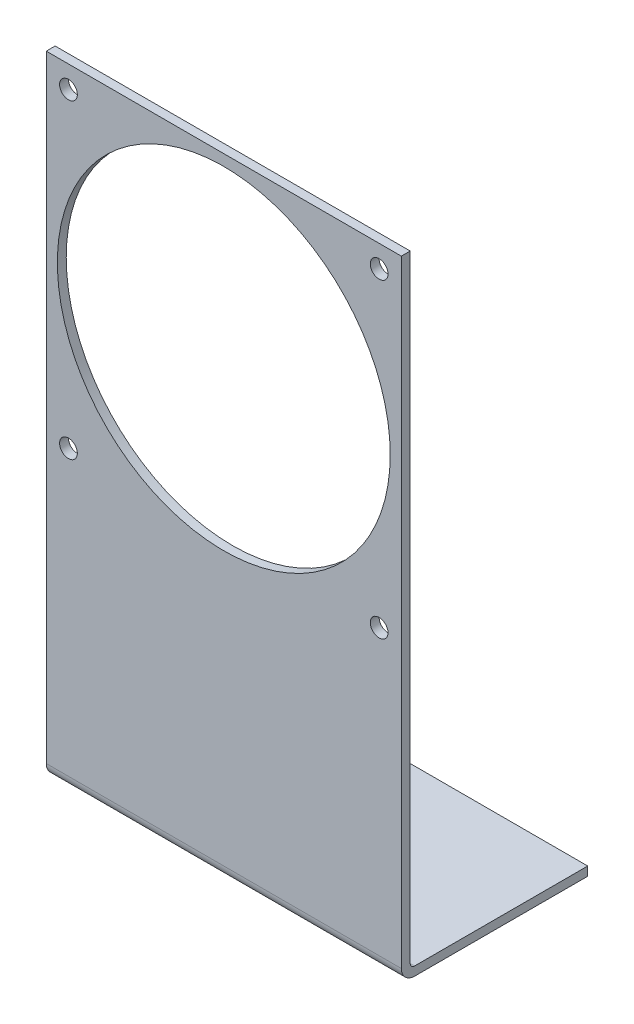
ISO-10303-21;
HEADER;
FILE_DESCRIPTION(('STEP AP214'),'2;1');
FILE_NAME('part.step','',(''),(''),'','','');
FILE_SCHEMA(('AUTOMOTIVE_DESIGN { 1 0 10303 214 1 1 1 1 }'));
ENDSEC;
DATA;
#1=APPLICATION_CONTEXT('core data for automotive mechanical design processes');
#2=APPLICATION_PROTOCOL_DEFINITION('international standard','automotive_design',2000,#1);
#3=PRODUCT_CONTEXT('',#1,'mechanical');
#4=PRODUCT('Part','Part','',(#3));
#5=PRODUCT_RELATED_PRODUCT_CATEGORY('part','',(#4));
#6=PRODUCT_DEFINITION_FORMATION('','',#4);
#7=PRODUCT_DEFINITION_CONTEXT('part definition',#1,'design');
#8=PRODUCT_DEFINITION('design','',#6,#7);
#9=PRODUCT_DEFINITION_SHAPE('','',#8);
#10=(LENGTH_UNIT() NAMED_UNIT(*) SI_UNIT(.MILLI.,.METRE.));
#11=(NAMED_UNIT(*) PLANE_ANGLE_UNIT() SI_UNIT($,.RADIAN.));
#12=(NAMED_UNIT(*) SI_UNIT($,.STERADIAN.) SOLID_ANGLE_UNIT());
#13=UNCERTAINTY_MEASURE_WITH_UNIT(LENGTH_MEASURE(1.E-05),#10,'distance_accuracy_value','');
#14=(GEOMETRIC_REPRESENTATION_CONTEXT(3) GLOBAL_UNCERTAINTY_ASSIGNED_CONTEXT((#13)) GLOBAL_UNIT_ASSIGNED_CONTEXT((#10,
#11,#12)) REPRESENTATION_CONTEXT('',''));
#15=CARTESIAN_POINT('',(0.,0.,0.));
#16=DIRECTION('',(0.,0.,1.));
#17=DIRECTION('',(1.,0.,0.));
#18=AXIS2_PLACEMENT_3D('',#15,#16,#17);
#19=CARTESIAN_POINT('',(0.,1.,40.));
#20=DIRECTION('',(-1.,0.,0.));
#21=DIRECTION('',(0.,1.,0.));
#22=AXIS2_PLACEMENT_3D('',#19,#20,#21);
#23=PLANE('',#22);
#24=DIRECTION('',(0.,1.,0.));
#25=VECTOR('',#24,1.);
#26=CARTESIAN_POINT('',(0.,1.,40.));
#27=LINE('',#26,#25);
#28=CARTESIAN_POINT('',(0.,1.,40.));
#29=VERTEX_POINT('',#28);
#30=CARTESIAN_POINT('',(0.,140.,40.));
#31=VERTEX_POINT('',#30);
#32=EDGE_CURVE('E140',#29,#31,#27,.T.);
#33=ORIENTED_EDGE('',*,*,#32,.F.);
#34=CARTESIAN_POINT('',(0.,0.999999999999995,39.));
#35=DIRECTION('',(-1.,0.,0.));
#36=DIRECTION('',(0.,0.,-1.));
#37=AXIS2_PLACEMENT_3D('',#34,#35,#36);
#38=CIRCLE('',#37,1.);
#39=CARTESIAN_POINT('',(0.,0.,39.));
#40=VERTEX_POINT('',#39);
#41=EDGE_CURVE('E143',#40,#29,#38,.T.);
#42=ORIENTED_EDGE('',*,*,#41,.F.);
#43=DIRECTION('',(0.,0.,1.));
#44=VECTOR('',#43,1.);
#45=CARTESIAN_POINT('',(0.,0.,0.));
#46=LINE('',#45,#44);
#47=CARTESIAN_POINT('',(0.,0.,0.));
#48=VERTEX_POINT('',#47);
#49=EDGE_CURVE('E96',#48,#40,#46,.T.);
#50=ORIENTED_EDGE('',*,*,#49,.F.);
#51=DIRECTION('',(0.,1.,0.));
#52=VECTOR('',#51,1.);
#53=CARTESIAN_POINT('',(0.,0.,0.));
#54=LINE('',#53,#52);
#55=CARTESIAN_POINT('',(0.,-2.,0.));
#56=VERTEX_POINT('',#55);
#57=EDGE_CURVE('E11',#56,#48,#54,.T.);
#58=ORIENTED_EDGE('',*,*,#57,.F.);
#59=DIRECTION('',(0.,0.,1.));
#60=VECTOR('',#59,1.);
#61=CARTESIAN_POINT('',(0.,-2.,0.));
#62=LINE('',#61,#60);
#63=CARTESIAN_POINT('',(0.,-2.00000000000001,39.));
#64=VERTEX_POINT('',#63);
#65=EDGE_CURVE('E93',#56,#64,#62,.T.);
#66=ORIENTED_EDGE('',*,*,#65,.T.);
#67=CARTESIAN_POINT('',(0.,0.999999999999995,39.));
#68=DIRECTION('',(1.,0.,0.));
#69=DIRECTION('',(0.,0.,-1.));
#70=AXIS2_PLACEMENT_3D('',#67,#68,#69);
#71=CIRCLE('',#70,3.);
#72=CARTESIAN_POINT('',(0.,1.,42.));
#73=VERTEX_POINT('',#72);
#74=EDGE_CURVE('E117',#64,#73,#71,.F.);
#75=ORIENTED_EDGE('',*,*,#74,.T.);
#76=DIRECTION('',(0.,1.,0.));
#77=VECTOR('',#76,1.);
#78=CARTESIAN_POINT('',(0.,1.,42.));
#79=LINE('',#78,#77);
#80=CARTESIAN_POINT('',(0.,140.,42.));
#81=VERTEX_POINT('',#80);
#82=EDGE_CURVE('E158',#73,#81,#79,.T.);
#83=ORIENTED_EDGE('',*,*,#82,.T.);
#84=DIRECTION('',(0.,0.,-1.));
#85=VECTOR('',#84,1.);
#86=CARTESIAN_POINT('',(0.,140.,40.));
#87=LINE('',#86,#85);
#88=EDGE_CURVE('E43',#81,#31,#87,.T.);
#89=ORIENTED_EDGE('',*,*,#88,.T.);
#90=EDGE_LOOP('',(#33,#42,#50,#58,#66,#75,#83,#89));
#91=FACE_BOUND('',#90,.T.);
#92=ADVANCED_FACE('F33',(#91),#23,.T.);
#93=CARTESIAN_POINT('',(0.,140.,40.));
#94=DIRECTION('',(0.,1.,0.));
#95=DIRECTION('',(1.,0.,0.));
#96=AXIS2_PLACEMENT_3D('',#93,#94,#95);
#97=PLANE('',#96);
#98=ORIENTED_EDGE('',*,*,#88,.F.);
#99=DIRECTION('',(-1.,0.,0.));
#100=VECTOR('',#99,1.);
#101=CARTESIAN_POINT('',(0.,140.,42.));
#102=LINE('',#101,#100);
#103=CARTESIAN_POINT('',(80.,140.,42.));
#104=VERTEX_POINT('',#103);
#105=EDGE_CURVE('E163',#81,#104,#102,.F.);
#106=ORIENTED_EDGE('',*,*,#105,.T.);
#107=DIRECTION('',(0.,0.,-1.));
#108=VECTOR('',#107,1.);
#109=CARTESIAN_POINT('',(80.,140.,40.));
#110=LINE('',#109,#108);
#111=CARTESIAN_POINT('',(80.,140.,40.));
#112=VERTEX_POINT('',#111);
#113=EDGE_CURVE('E120',#104,#112,#110,.T.);
#114=ORIENTED_EDGE('',*,*,#113,.T.);
#115=DIRECTION('',(1.,0.,0.));
#116=VECTOR('',#115,1.);
#117=CARTESIAN_POINT('',(0.,140.,40.));
#118=LINE('',#117,#116);
#119=EDGE_CURVE('E142',#31,#112,#118,.T.);
#120=ORIENTED_EDGE('',*,*,#119,.F.);
#121=EDGE_LOOP('',(#98,#106,#114,#120));
#122=FACE_BOUND('',#121,.T.);
#123=ADVANCED_FACE('F171',(#122),#97,.T.);
#124=CARTESIAN_POINT('',(80.,0.,0.));
#125=DIRECTION('',(-1.,0.,0.));
#126=DIRECTION('',(0.,0.,1.));
#127=AXIS2_PLACEMENT_3D('',#124,#125,#126);
#128=PLANE('',#127);
#129=DIRECTION('',(0.,0.,1.));
#130=VECTOR('',#129,1.);
#131=CARTESIAN_POINT('',(80.,0.,0.));
#132=LINE('',#131,#130);
#133=CARTESIAN_POINT('',(80.,0.,0.));
#134=VERTEX_POINT('',#133);
#135=CARTESIAN_POINT('',(80.,0.,39.));
#136=VERTEX_POINT('',#135);
#137=EDGE_CURVE('E134',#134,#136,#132,.T.);
#138=ORIENTED_EDGE('',*,*,#137,.T.);
#139=CARTESIAN_POINT('',(80.,0.999999999999995,39.));
#140=DIRECTION('',(-1.,0.,0.));
#141=DIRECTION('',(0.,0.,-1.));
#142=AXIS2_PLACEMENT_3D('',#139,#140,#141);
#143=CIRCLE('',#142,1.);
#144=CARTESIAN_POINT('',(80.,1.,40.));
#145=VERTEX_POINT('',#144);
#146=EDGE_CURVE('E147',#136,#145,#143,.T.);
#147=ORIENTED_EDGE('',*,*,#146,.T.);
#148=DIRECTION('',(0.,1.,0.));
#149=VECTOR('',#148,1.);
#150=CARTESIAN_POINT('',(80.,1.,40.));
#151=LINE('',#150,#149);
#152=EDGE_CURVE('E111',#145,#112,#151,.T.);
#153=ORIENTED_EDGE('',*,*,#152,.T.);
#154=ORIENTED_EDGE('',*,*,#113,.F.);
#155=DIRECTION('',(0.,1.,0.));
#156=VECTOR('',#155,1.);
#157=CARTESIAN_POINT('',(80.,1.,42.));
#158=LINE('',#157,#156);
#159=CARTESIAN_POINT('',(80.,1.00000000000002,42.));
#160=VERTEX_POINT('',#159);
#161=EDGE_CURVE('E159',#160,#104,#158,.T.);
#162=ORIENTED_EDGE('',*,*,#161,.F.);
#163=CARTESIAN_POINT('',(80.,0.999999999999995,39.));
#164=DIRECTION('',(1.,0.,0.));
#165=DIRECTION('',(0.,0.,-1.));
#166=AXIS2_PLACEMENT_3D('',#163,#164,#165);
#167=CIRCLE('',#166,3.);
#168=CARTESIAN_POINT('',(80.,-2.,39.));
#169=VERTEX_POINT('',#168);
#170=EDGE_CURVE('E155',#169,#160,#167,.F.);
#171=ORIENTED_EDGE('',*,*,#170,.F.);
#172=DIRECTION('',(0.,0.,1.));
#173=VECTOR('',#172,1.);
#174=CARTESIAN_POINT('',(80.,-2.,0.));
#175=LINE('',#174,#173);
#176=CARTESIAN_POINT('',(80.,-2.,0.));
#177=VERTEX_POINT('',#176);
#178=EDGE_CURVE('E106',#177,#169,#175,.T.);
#179=ORIENTED_EDGE('',*,*,#178,.F.);
#180=DIRECTION('',(0.,1.,0.));
#181=VECTOR('',#180,1.);
#182=CARTESIAN_POINT('',(80.,0.,0.));
#183=LINE('',#182,#181);
#184=EDGE_CURVE('E37',#177,#134,#183,.T.);
#185=ORIENTED_EDGE('',*,*,#184,.T.);
#186=EDGE_LOOP('',(#138,#147,#153,#154,#162,#171,#179,#185));
#187=FACE_BOUND('',#186,.T.);
#188=ADVANCED_FACE('F175',(#187),#128,.F.);
#189=CARTESIAN_POINT('',(0.,0.,0.));
#190=DIRECTION('',(0.,0.,1.));
#191=DIRECTION('',(1.,0.,0.));
#192=AXIS2_PLACEMENT_3D('',#189,#190,#191);
#193=PLANE('',#192);
#194=DIRECTION('',(1.,0.,0.));
#195=VECTOR('',#194,1.);
#196=CARTESIAN_POINT('',(0.,-2.,0.));
#197=LINE('',#196,#195);
#198=EDGE_CURVE('E102',#56,#177,#197,.T.);
#199=ORIENTED_EDGE('',*,*,#198,.F.);
#200=ORIENTED_EDGE('',*,*,#57,.T.);
#201=DIRECTION('',(1.,0.,0.));
#202=VECTOR('',#201,1.);
#203=CARTESIAN_POINT('',(0.,0.,0.));
#204=LINE('',#203,#202);
#205=EDGE_CURVE('E129',#48,#134,#204,.T.);
#206=ORIENTED_EDGE('',*,*,#205,.T.);
#207=ORIENTED_EDGE('',*,*,#184,.F.);
#208=EDGE_LOOP('',(#199,#200,#206,#207));
#209=FACE_BOUND('',#208,.T.);
#210=ADVANCED_FACE('F35',(#209),#193,.F.);
#211=CARTESIAN_POINT('',(0.,0.,0.));
#212=DIRECTION('',(0.,1.,0.));
#213=DIRECTION('',(0.,0.,1.));
#214=AXIS2_PLACEMENT_3D('',#211,#212,#213);
#215=PLANE('',#214);
#216=ORIENTED_EDGE('',*,*,#137,.F.);
#217=ORIENTED_EDGE('',*,*,#205,.F.);
#218=ORIENTED_EDGE('',*,*,#49,.T.);
#219=DIRECTION('',(1.,0.,0.));
#220=VECTOR('',#219,1.);
#221=CARTESIAN_POINT('',(0.,0.,39.));
#222=LINE('',#221,#220);
#223=EDGE_CURVE('E145',#40,#136,#222,.T.);
#224=ORIENTED_EDGE('',*,*,#223,.T.);
#225=EDGE_LOOP('',(#216,#217,#218,#224));
#226=FACE_BOUND('',#225,.T.);
#227=ADVANCED_FACE('F179',(#226),#215,.T.);
#228=CARTESIAN_POINT('',(0.,0.999999999999995,39.));
#229=DIRECTION('',(1.,0.,0.));
#230=DIRECTION('',(0.,0.,-1.));
#231=AXIS2_PLACEMENT_3D('',#228,#229,#230);
#232=CYLINDRICAL_SURFACE('',#231,1.);
#233=ORIENTED_EDGE('',*,*,#146,.F.);
#234=ORIENTED_EDGE('',*,*,#223,.F.);
#235=ORIENTED_EDGE('',*,*,#41,.T.);
#236=DIRECTION('',(1.,0.,0.));
#237=VECTOR('',#236,1.);
#238=CARTESIAN_POINT('',(0.,1.,40.));
#239=LINE('',#238,#237);
#240=EDGE_CURVE('E114',#29,#145,#239,.T.);
#241=ORIENTED_EDGE('',*,*,#240,.T.);
#242=EDGE_LOOP('',(#233,#234,#235,#241));
#243=FACE_BOUND('',#242,.T.);
#244=ADVANCED_FACE('F177',(#243),#232,.F.);
#245=CARTESIAN_POINT('',(0.,1.,40.));
#246=DIRECTION('',(0.,0.,-1.));
#247=DIRECTION('',(-1.,0.,0.));
#248=AXIS2_PLACEMENT_3D('',#245,#246,#247);
#249=PLANE('',#248);
#250=CARTESIAN_POINT('',(5.00000000000002,65.,40.));
#251=DIRECTION('',(0.,0.,-1.));
#252=DIRECTION('',(-1.,0.,0.));
#253=AXIS2_PLACEMENT_3D('',#250,#251,#252);
#254=CIRCLE('',#253,1.99999999999999);
#255=CARTESIAN_POINT('',(3.00000000000003,65.,40.));
#256=VERTEX_POINT('',#255);
#257=EDGE_CURVE('E236',#256,#256,#254,.T.);
#258=ORIENTED_EDGE('',*,*,#257,.F.);
#259=EDGE_LOOP('',(#258));
#260=FACE_BOUND('',#259,.T.);
#261=CARTESIAN_POINT('',(75.,65.,40.));
#262=DIRECTION('',(0.,0.,-1.));
#263=DIRECTION('',(-1.,0.,0.));
#264=AXIS2_PLACEMENT_3D('',#261,#262,#263);
#265=CIRCLE('',#264,2.00000000000001);
#266=CARTESIAN_POINT('',(73.,65.,40.));
#267=VERTEX_POINT('',#266);
#268=EDGE_CURVE('E246',#267,#267,#265,.T.);
#269=ORIENTED_EDGE('',*,*,#268,.F.);
#270=EDGE_LOOP('',(#269));
#271=FACE_BOUND('',#270,.T.);
#272=CARTESIAN_POINT('',(75.,135.,40.));
#273=DIRECTION('',(0.,0.,-1.));
#274=DIRECTION('',(-1.,0.,0.));
#275=AXIS2_PLACEMENT_3D('',#272,#273,#274);
#276=CIRCLE('',#275,2.00000000000001);
#277=CARTESIAN_POINT('',(73.,135.,40.));
#278=VERTEX_POINT('',#277);
#279=EDGE_CURVE('E252',#278,#278,#276,.T.);
#280=ORIENTED_EDGE('',*,*,#279,.F.);
#281=EDGE_LOOP('',(#280));
#282=FACE_BOUND('',#281,.T.);
#283=CARTESIAN_POINT('',(5.00000000000002,135.,40.));
#284=DIRECTION('',(0.,0.,-1.));
#285=DIRECTION('',(-1.,0.,0.));
#286=AXIS2_PLACEMENT_3D('',#283,#284,#285);
#287=CIRCLE('',#286,2.);
#288=CARTESIAN_POINT('',(3.00000000000001,135.,40.));
#289=VERTEX_POINT('',#288);
#290=EDGE_CURVE('E258',#289,#289,#287,.T.);
#291=ORIENTED_EDGE('',*,*,#290,.F.);
#292=EDGE_LOOP('',(#291));
#293=FACE_BOUND('',#292,.T.);
#294=CARTESIAN_POINT('',(40.,100.,40.));
#295=DIRECTION('',(0.,0.,-1.));
#296=DIRECTION('',(-1.,0.,0.));
#297=AXIS2_PLACEMENT_3D('',#294,#295,#296);
#298=CIRCLE('',#297,37.5);
#299=CARTESIAN_POINT('',(2.5,100.,40.));
#300=VERTEX_POINT('',#299);
#301=EDGE_CURVE('E138',#300,#300,#298,.T.);
#302=ORIENTED_EDGE('',*,*,#301,.F.);
#303=EDGE_LOOP('',(#302));
#304=FACE_BOUND('',#303,.T.);
#305=ORIENTED_EDGE('',*,*,#152,.F.);
#306=ORIENTED_EDGE('',*,*,#240,.F.);
#307=ORIENTED_EDGE('',*,*,#32,.T.);
#308=ORIENTED_EDGE('',*,*,#119,.T.);
#309=EDGE_LOOP('',(#305,#306,#307,#308));
#310=FACE_BOUND('',#309,.T.);
#311=ADVANCED_FACE('F173',(#260,#271,#282,#293,#304,#310),#249,.T.);
#312=CARTESIAN_POINT('',(0.,-2.,0.));
#313=DIRECTION('',(0.,1.,0.));
#314=DIRECTION('',(0.,0.,1.));
#315=AXIS2_PLACEMENT_3D('',#312,#313,#314);
#316=PLANE('',#315);
#317=ORIENTED_EDGE('',*,*,#178,.T.);
#318=DIRECTION('',(1.,0.,0.));
#319=VECTOR('',#318,1.);
#320=CARTESIAN_POINT('',(0.,-2.,39.));
#321=LINE('',#320,#319);
#322=EDGE_CURVE('E109',#64,#169,#321,.T.);
#323=ORIENTED_EDGE('',*,*,#322,.F.);
#324=ORIENTED_EDGE('',*,*,#65,.F.);
#325=ORIENTED_EDGE('',*,*,#198,.T.);
#326=EDGE_LOOP('',(#317,#323,#324,#325));
#327=FACE_BOUND('',#326,.T.);
#328=ADVANCED_FACE('F108',(#327),#316,.F.);
#329=CARTESIAN_POINT('',(0.,0.999999999999995,39.));
#330=DIRECTION('',(1.,0.,0.));
#331=DIRECTION('',(0.,0.,-1.));
#332=AXIS2_PLACEMENT_3D('',#329,#330,#331);
#333=CYLINDRICAL_SURFACE('',#332,3.);
#334=ORIENTED_EDGE('',*,*,#170,.T.);
#335=DIRECTION('',(1.,0.,0.));
#336=VECTOR('',#335,1.);
#337=CARTESIAN_POINT('',(0.,1.00000000000002,42.));
#338=LINE('',#337,#336);
#339=EDGE_CURVE('E156',#73,#160,#338,.T.);
#340=ORIENTED_EDGE('',*,*,#339,.F.);
#341=ORIENTED_EDGE('',*,*,#74,.F.);
#342=ORIENTED_EDGE('',*,*,#322,.T.);
#343=EDGE_LOOP('',(#334,#340,#341,#342));
#344=FACE_BOUND('',#343,.T.);
#345=ADVANCED_FACE('F199',(#344),#333,.T.);
#346=CARTESIAN_POINT('',(0.,1.,42.));
#347=DIRECTION('',(0.,0.,-1.));
#348=DIRECTION('',(-1.,0.,0.));
#349=AXIS2_PLACEMENT_3D('',#346,#347,#348);
#350=PLANE('',#349);
#351=CARTESIAN_POINT('',(5.00000000000002,65.,42.));
#352=DIRECTION('',(0.,0.,1.));
#353=DIRECTION('',(-1.,0.,0.));
#354=AXIS2_PLACEMENT_3D('',#351,#352,#353);
#355=CIRCLE('',#354,1.99999999999999);
#356=CARTESIAN_POINT('',(3.00000000000003,65.,42.));
#357=VERTEX_POINT('',#356);
#358=EDGE_CURVE('E239',#357,#357,#355,.T.);
#359=ORIENTED_EDGE('',*,*,#358,.F.);
#360=EDGE_LOOP('',(#359));
#361=FACE_BOUND('',#360,.T.);
#362=CARTESIAN_POINT('',(75.,65.,42.));
#363=DIRECTION('',(0.,0.,1.));
#364=DIRECTION('',(1.,0.,0.));
#365=AXIS2_PLACEMENT_3D('',#362,#363,#364);
#366=CIRCLE('',#365,2.00000000000001);
#367=CARTESIAN_POINT('',(77.,65.,42.));
#368=VERTEX_POINT('',#367);
#369=EDGE_CURVE('E241',#368,#368,#366,.T.);
#370=ORIENTED_EDGE('',*,*,#369,.F.);
#371=EDGE_LOOP('',(#370));
#372=FACE_BOUND('',#371,.T.);
#373=CARTESIAN_POINT('',(75.,135.,42.));
#374=DIRECTION('',(0.,0.,1.));
#375=DIRECTION('',(-1.,0.,0.));
#376=AXIS2_PLACEMENT_3D('',#373,#374,#375);
#377=CIRCLE('',#376,2.00000000000001);
#378=CARTESIAN_POINT('',(73.,135.,42.));
#379=VERTEX_POINT('',#378);
#380=EDGE_CURVE('E249',#379,#379,#377,.T.);
#381=ORIENTED_EDGE('',*,*,#380,.F.);
#382=EDGE_LOOP('',(#381));
#383=FACE_BOUND('',#382,.T.);
#384=CARTESIAN_POINT('',(5.00000000000002,135.,42.));
#385=DIRECTION('',(0.,0.,1.));
#386=DIRECTION('',(1.,0.,0.));
#387=AXIS2_PLACEMENT_3D('',#384,#385,#386);
#388=CIRCLE('',#387,2.);
#389=CARTESIAN_POINT('',(7.00000000000002,135.,42.));
#390=VERTEX_POINT('',#389);
#391=EDGE_CURVE('E255',#390,#390,#388,.T.);
#392=ORIENTED_EDGE('',*,*,#391,.F.);
#393=EDGE_LOOP('',(#392));
#394=FACE_BOUND('',#393,.T.);
#395=CARTESIAN_POINT('',(40.,100.,42.));
#396=DIRECTION('',(0.,0.,1.));
#397=DIRECTION('',(1.,0.,0.));
#398=AXIS2_PLACEMENT_3D('',#395,#396,#397);
#399=CIRCLE('',#398,37.5);
#400=CARTESIAN_POINT('',(77.5,100.,42.));
#401=VERTEX_POINT('',#400);
#402=EDGE_CURVE('E260',#401,#401,#399,.T.);
#403=ORIENTED_EDGE('',*,*,#402,.F.);
#404=EDGE_LOOP('',(#403));
#405=FACE_BOUND('',#404,.T.);
#406=ORIENTED_EDGE('',*,*,#161,.T.);
#407=ORIENTED_EDGE('',*,*,#105,.F.);
#408=ORIENTED_EDGE('',*,*,#82,.F.);
#409=ORIENTED_EDGE('',*,*,#339,.T.);
#410=EDGE_LOOP('',(#406,#407,#408,#409));
#411=FACE_BOUND('',#410,.T.);
#412=ADVANCED_FACE('F169',(#361,#372,#383,#394,#405,#411),#350,.F.);
#413=CARTESIAN_POINT('',(40.,100.,-38.));
#414=DIRECTION('',(0.,0.,1.));
#415=DIRECTION('',(1.,0.,0.));
#416=AXIS2_PLACEMENT_3D('',#413,#414,#415);
#417=CYLINDRICAL_SURFACE('',#416,37.5);
#418=ORIENTED_EDGE('',*,*,#301,.T.);
#419=EDGE_LOOP('',(#418));
#420=FACE_BOUND('',#419,.T.);
#421=ORIENTED_EDGE('',*,*,#402,.T.);
#422=EDGE_LOOP('',(#421));
#423=FACE_BOUND('',#422,.T.);
#424=ADVANCED_FACE('F198',(#420,#423),#417,.F.);
#425=CARTESIAN_POINT('',(5.00000000000002,135.,-38.));
#426=DIRECTION('',(0.,0.,1.));
#427=DIRECTION('',(1.,0.,0.));
#428=AXIS2_PLACEMENT_3D('',#425,#426,#427);
#429=CYLINDRICAL_SURFACE('',#428,2.);
#430=ORIENTED_EDGE('',*,*,#290,.T.);
#431=EDGE_LOOP('',(#430));
#432=FACE_BOUND('',#431,.T.);
#433=ORIENTED_EDGE('',*,*,#391,.T.);
#434=EDGE_LOOP('',(#433));
#435=FACE_BOUND('',#434,.T.);
#436=ADVANCED_FACE('F216',(#432,#435),#429,.F.);
#437=CARTESIAN_POINT('',(75.,135.,-38.));
#438=DIRECTION('',(0.,0.,1.));
#439=DIRECTION('',(1.,0.,0.));
#440=AXIS2_PLACEMENT_3D('',#437,#438,#439);
#441=CYLINDRICAL_SURFACE('',#440,2.00000000000001);
#442=ORIENTED_EDGE('',*,*,#279,.T.);
#443=EDGE_LOOP('',(#442));
#444=FACE_BOUND('',#443,.T.);
#445=ORIENTED_EDGE('',*,*,#380,.T.);
#446=EDGE_LOOP('',(#445));
#447=FACE_BOUND('',#446,.T.);
#448=ADVANCED_FACE('F220',(#444,#447),#441,.F.);
#449=CARTESIAN_POINT('',(75.,65.,-38.));
#450=DIRECTION('',(0.,0.,1.));
#451=DIRECTION('',(1.,0.,0.));
#452=AXIS2_PLACEMENT_3D('',#449,#450,#451);
#453=CYLINDRICAL_SURFACE('',#452,2.00000000000001);
#454=ORIENTED_EDGE('',*,*,#268,.T.);
#455=EDGE_LOOP('',(#454));
#456=FACE_BOUND('',#455,.T.);
#457=ORIENTED_EDGE('',*,*,#369,.T.);
#458=EDGE_LOOP('',(#457));
#459=FACE_BOUND('',#458,.T.);
#460=ADVANCED_FACE('F224',(#456,#459),#453,.F.);
#461=CARTESIAN_POINT('',(5.00000000000002,65.,-38.));
#462=DIRECTION('',(0.,0.,1.));
#463=DIRECTION('',(1.,0.,0.));
#464=AXIS2_PLACEMENT_3D('',#461,#462,#463);
#465=CYLINDRICAL_SURFACE('',#464,1.99999999999999);
#466=ORIENTED_EDGE('',*,*,#257,.T.);
#467=EDGE_LOOP('',(#466));
#468=FACE_BOUND('',#467,.T.);
#469=ORIENTED_EDGE('',*,*,#358,.T.);
#470=EDGE_LOOP('',(#469));
#471=FACE_BOUND('',#470,.T.);
#472=ADVANCED_FACE('F228',(#468,#471),#465,.F.);
#473=CLOSED_SHELL('',(#92,#123,#188,#210,#227,#244,#311,#328,#345,#412,#424,#436,#448,#460,#472));
#474=MANIFOLD_SOLID_BREP('B2',#473);
#475=ADVANCED_BREP_SHAPE_REPRESENTATION('',(#18,#474),#14);
#476=SHAPE_DEFINITION_REPRESENTATION(#9,#475);
ENDSEC;
END-ISO-10303-21;
